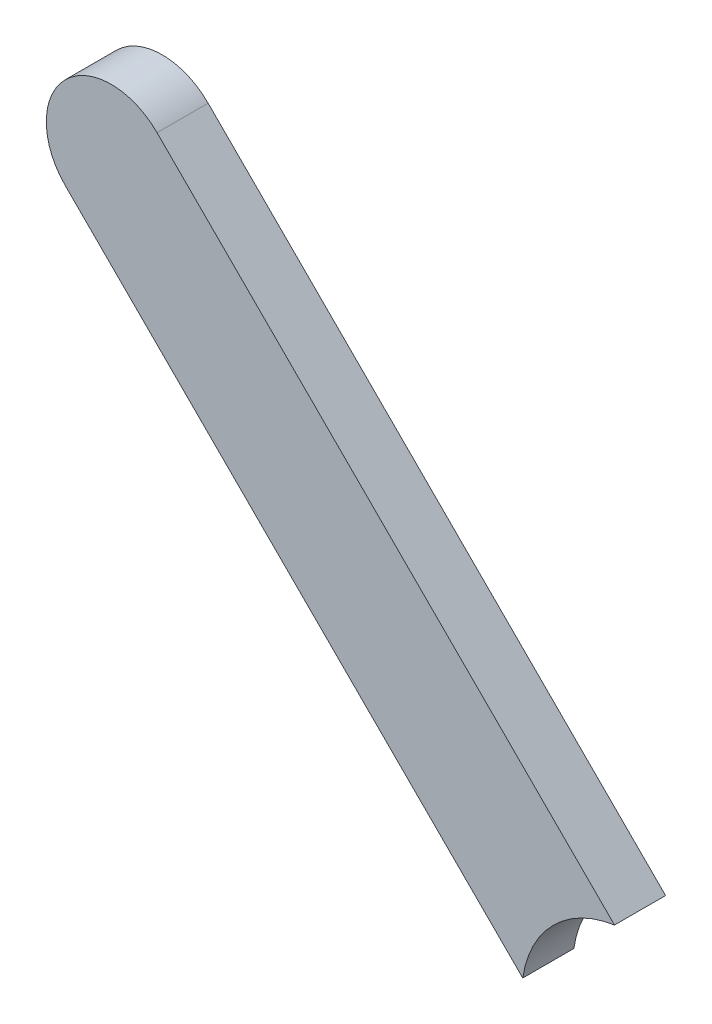
ISO-10303-21;
HEADER;
FILE_DESCRIPTION(('STEP AP214'),'2;1');
FILE_NAME('part.step','',(''),(''),'','','');
FILE_SCHEMA(('AUTOMOTIVE_DESIGN { 1 0 10303 214 1 1 1 1 }'));
ENDSEC;
DATA;
#1=APPLICATION_CONTEXT('core data for automotive mechanical design processes');
#2=APPLICATION_PROTOCOL_DEFINITION('international standard','automotive_design',2000,#1);
#3=PRODUCT_CONTEXT('',#1,'mechanical');
#4=PRODUCT('Part','Part','',(#3));
#5=PRODUCT_RELATED_PRODUCT_CATEGORY('part','',(#4));
#6=PRODUCT_DEFINITION_FORMATION('','',#4);
#7=PRODUCT_DEFINITION_CONTEXT('part definition',#1,'design');
#8=PRODUCT_DEFINITION('design','',#6,#7);
#9=PRODUCT_DEFINITION_SHAPE('','',#8);
#10=(LENGTH_UNIT() NAMED_UNIT(*) SI_UNIT(.MILLI.,.METRE.));
#11=(NAMED_UNIT(*) PLANE_ANGLE_UNIT() SI_UNIT($,.RADIAN.));
#12=(NAMED_UNIT(*) SI_UNIT($,.STERADIAN.) SOLID_ANGLE_UNIT());
#13=UNCERTAINTY_MEASURE_WITH_UNIT(LENGTH_MEASURE(1.E-05),#10,'distance_accuracy_value','');
#14=(GEOMETRIC_REPRESENTATION_CONTEXT(3) GLOBAL_UNCERTAINTY_ASSIGNED_CONTEXT((#13)) GLOBAL_UNIT_ASSIGNED_CONTEXT((#10,
#11,#12)) REPRESENTATION_CONTEXT('',''));
#15=CARTESIAN_POINT('',(0.,0.,0.));
#16=DIRECTION('',(0.,0.,1.));
#17=DIRECTION('',(1.,0.,0.));
#18=AXIS2_PLACEMENT_3D('',#15,#16,#17);
#19=CARTESIAN_POINT('',(134.8213966,57.47839406,0.));
#20=DIRECTION('',(0.70710678118655,0.707106781186545,0.));
#21=DIRECTION('',(0.707106781186545,-0.70710678118655,0.));
#22=AXIS2_PLACEMENT_3D('',#19,#20,#21);
#23=PLANE('',#22);
#24=DIRECTION('',(0.707106781186545,-0.70710678118655,0.));
#25=VECTOR('',#24,1.);
#26=CARTESIAN_POINT('',(134.8213966,57.47839406,0.1999996));
#27=LINE('',#26,#25);
#28=CARTESIAN_POINT('',(134.8213966,57.47839406,0.1999996));
#29=VERTEX_POINT('',#28);
#30=CARTESIAN_POINT('',(136.612449607867,55.6873410521332,0.1999996));
#31=VERTEX_POINT('',#30);
#32=EDGE_CURVE('E11',#29,#31,#27,.T.);
#33=ORIENTED_EDGE('',*,*,#32,.F.);
#34=DIRECTION('',(0.,0.,1.));
#35=VECTOR('',#34,1.);
#36=CARTESIAN_POINT('',(134.8213966,57.47839406,0.));
#37=LINE('',#36,#35);
#38=CARTESIAN_POINT('',(134.8213966,57.47839406,0.));
#39=VERTEX_POINT('',#38);
#40=EDGE_CURVE('E24',#39,#29,#37,.T.);
#41=ORIENTED_EDGE('',*,*,#40,.F.);
#42=DIRECTION('',(0.707106781186545,-0.70710678118655,0.));
#43=VECTOR('',#42,1.);
#44=CARTESIAN_POINT('',(134.8213966,57.47839406,0.));
#45=LINE('',#44,#43);
#46=CARTESIAN_POINT('',(136.612449607867,55.6873410521332,0.));
#47=VERTEX_POINT('',#46);
#48=EDGE_CURVE('E75',#39,#47,#45,.T.);
#49=ORIENTED_EDGE('',*,*,#48,.T.);
#50=DIRECTION('',(0.,0.,1.));
#51=VECTOR('',#50,1.);
#52=CARTESIAN_POINT('',(136.612449607867,55.6873410521332,0.));
#53=LINE('',#52,#51);
#54=EDGE_CURVE('E37',#47,#31,#53,.T.);
#55=ORIENTED_EDGE('',*,*,#54,.T.);
#56=EDGE_LOOP('',(#33,#41,#49,#55));
#57=FACE_BOUND('',#56,.T.);
#58=ADVANCED_FACE('F17',(#57),#23,.F.);
#59=CARTESIAN_POINT('',(137.033,55.626,0.));
#60=DIRECTION('',(0.,0.,-1.));
#61=DIRECTION('',(1.,0.,0.));
#62=AXIS2_PLACEMENT_3D('',#59,#60,#61);
#63=CYLINDRICAL_SURFACE('',#62,0.42500042);
#64=DIRECTION('',(0.,0.,1.));
#65=VECTOR('',#64,1.);
#66=CARTESIAN_POINT('',(136.971658947867,56.0465503921332,0.));
#67=LINE('',#66,#65);
#68=CARTESIAN_POINT('',(136.971658947867,56.0465503921332,0.));
#69=VERTEX_POINT('',#68);
#70=CARTESIAN_POINT('',(136.971658947867,56.0465503921332,0.1999996));
#71=VERTEX_POINT('',#70);
#72=EDGE_CURVE('E67',#69,#71,#67,.T.);
#73=ORIENTED_EDGE('',*,*,#72,.T.);
#74=CARTESIAN_POINT('',(137.033,55.626,0.1999996));
#75=DIRECTION('',(0.,0.,1.));
#76=DIRECTION('',(1.,0.,0.));
#77=AXIS2_PLACEMENT_3D('',#74,#75,#76);
#78=CIRCLE('',#77,0.42500042);
#79=EDGE_CURVE('E82',#71,#31,#78,.T.);
#80=ORIENTED_EDGE('',*,*,#79,.T.);
#81=ORIENTED_EDGE('',*,*,#54,.F.);
#82=CARTESIAN_POINT('',(137.033,55.626,0.));
#83=DIRECTION('',(0.,0.,1.));
#84=DIRECTION('',(1.,0.,0.));
#85=AXIS2_PLACEMENT_3D('',#82,#83,#84);
#86=CIRCLE('',#85,0.42500042);
#87=EDGE_CURVE('E80',#69,#47,#86,.T.);
#88=ORIENTED_EDGE('',*,*,#87,.F.);
#89=EDGE_LOOP('',(#73,#80,#81,#88));
#90=FACE_BOUND('',#89,.T.);
#91=ADVANCED_FACE('F88',(#90),#63,.F.);
#92=CARTESIAN_POINT('',(136.971658947867,56.0465503921332,0.));
#93=DIRECTION('',(-0.707106781186545,-0.70710678118655,0.));
#94=DIRECTION('',(-0.70710678118655,0.707106781186545,0.));
#95=AXIS2_PLACEMENT_3D('',#92,#93,#94);
#96=PLANE('',#95);
#97=DIRECTION('',(-0.70710678118655,0.707106781186545,0.));
#98=VECTOR('',#97,1.);
#99=CARTESIAN_POINT('',(137.2126034,55.80560594,0.1999996));
#100=LINE('',#99,#98);
#101=CARTESIAN_POINT('',(135.18060594,57.8376034,0.1999996));
#102=VERTEX_POINT('',#101);
#103=EDGE_CURVE('E71',#71,#102,#100,.T.);
#104=ORIENTED_EDGE('',*,*,#103,.F.);
#105=ORIENTED_EDGE('',*,*,#72,.F.);
#106=DIRECTION('',(-0.70710678118655,0.707106781186545,0.));
#107=VECTOR('',#106,1.);
#108=CARTESIAN_POINT('',(137.2126034,55.80560594,0.));
#109=LINE('',#108,#107);
#110=CARTESIAN_POINT('',(135.18060594,57.8376034,0.));
#111=VERTEX_POINT('',#110);
#112=EDGE_CURVE('E63',#69,#111,#109,.T.);
#113=ORIENTED_EDGE('',*,*,#112,.T.);
#114=DIRECTION('',(0.,0.,1.));
#115=VECTOR('',#114,1.);
#116=CARTESIAN_POINT('',(135.18060594,57.8376034,0.));
#117=LINE('',#116,#115);
#118=EDGE_CURVE('E53',#111,#102,#117,.T.);
#119=ORIENTED_EDGE('',*,*,#118,.T.);
#120=EDGE_LOOP('',(#104,#105,#113,#119));
#121=FACE_BOUND('',#120,.T.);
#122=ADVANCED_FACE('F66',(#121),#96,.F.);
#123=CARTESIAN_POINT('',(135.00100127,57.65799873,0.));
#124=DIRECTION('',(0.,0.,-1.));
#125=DIRECTION('',(0.707106781186506,0.70710678118659,0.));
#126=AXIS2_PLACEMENT_3D('',#123,#124,#125);
#127=CYLINDRICAL_SURFACE('',#126,0.253999360179539);
#128=CARTESIAN_POINT('',(135.00100127,57.65799873,0.1999996));
#129=DIRECTION('',(0.,0.,1.));
#130=DIRECTION('',(0.707106781186506,0.70710678118659,0.));
#131=AXIS2_PLACEMENT_3D('',#128,#129,#130);
#132=CIRCLE('',#131,0.253999360179539);
#133=EDGE_CURVE('E59',#102,#29,#132,.T.);
#134=ORIENTED_EDGE('',*,*,#133,.F.);
#135=ORIENTED_EDGE('',*,*,#118,.F.);
#136=CARTESIAN_POINT('',(135.00100127,57.65799873,0.));
#137=DIRECTION('',(0.,0.,1.));
#138=DIRECTION('',(0.707106781186506,0.70710678118659,0.));
#139=AXIS2_PLACEMENT_3D('',#136,#137,#138);
#140=CIRCLE('',#139,0.253999360179539);
#141=EDGE_CURVE('E57',#111,#39,#140,.T.);
#142=ORIENTED_EDGE('',*,*,#141,.T.);
#143=ORIENTED_EDGE('',*,*,#40,.T.);
#144=EDGE_LOOP('',(#134,#135,#142,#143));
#145=FACE_BOUND('',#144,.T.);
#146=ADVANCED_FACE('F55',(#145),#127,.T.);
#147=CARTESIAN_POINT('',(134.8213966,57.47839406,0.));
#148=DIRECTION('',(0.,0.,-1.));
#149=DIRECTION('',(-1.,0.,0.));
#150=AXIS2_PLACEMENT_3D('',#147,#148,#149);
#151=PLANE('',#150);
#152=ORIENTED_EDGE('',*,*,#48,.F.);
#153=ORIENTED_EDGE('',*,*,#141,.F.);
#154=ORIENTED_EDGE('',*,*,#112,.F.);
#155=ORIENTED_EDGE('',*,*,#87,.T.);
#156=EDGE_LOOP('',(#152,#153,#154,#155));
#157=FACE_BOUND('',#156,.T.);
#158=ADVANCED_FACE('F74',(#157),#151,.T.);
#159=CARTESIAN_POINT('',(134.8213966,57.47839406,0.1999996));
#160=DIRECTION('',(0.,0.,-1.));
#161=DIRECTION('',(-1.,0.,0.));
#162=AXIS2_PLACEMENT_3D('',#159,#160,#161);
#163=PLANE('',#162);
#164=ORIENTED_EDGE('',*,*,#133,.T.);
#165=ORIENTED_EDGE('',*,*,#32,.T.);
#166=ORIENTED_EDGE('',*,*,#79,.F.);
#167=ORIENTED_EDGE('',*,*,#103,.T.);
#168=EDGE_LOOP('',(#164,#165,#166,#167));
#169=FACE_BOUND('',#168,.T.);
#170=ADVANCED_FACE('F91',(#169),#163,.F.);
#171=CLOSED_SHELL('',(#58,#91,#122,#146,#158,#170));
#172=MANIFOLD_SOLID_BREP('B1',#171);
#173=ADVANCED_BREP_SHAPE_REPRESENTATION('',(#18,#172),#14);
#174=SHAPE_DEFINITION_REPRESENTATION(#9,#173);
ENDSEC;
END-ISO-10303-21;
